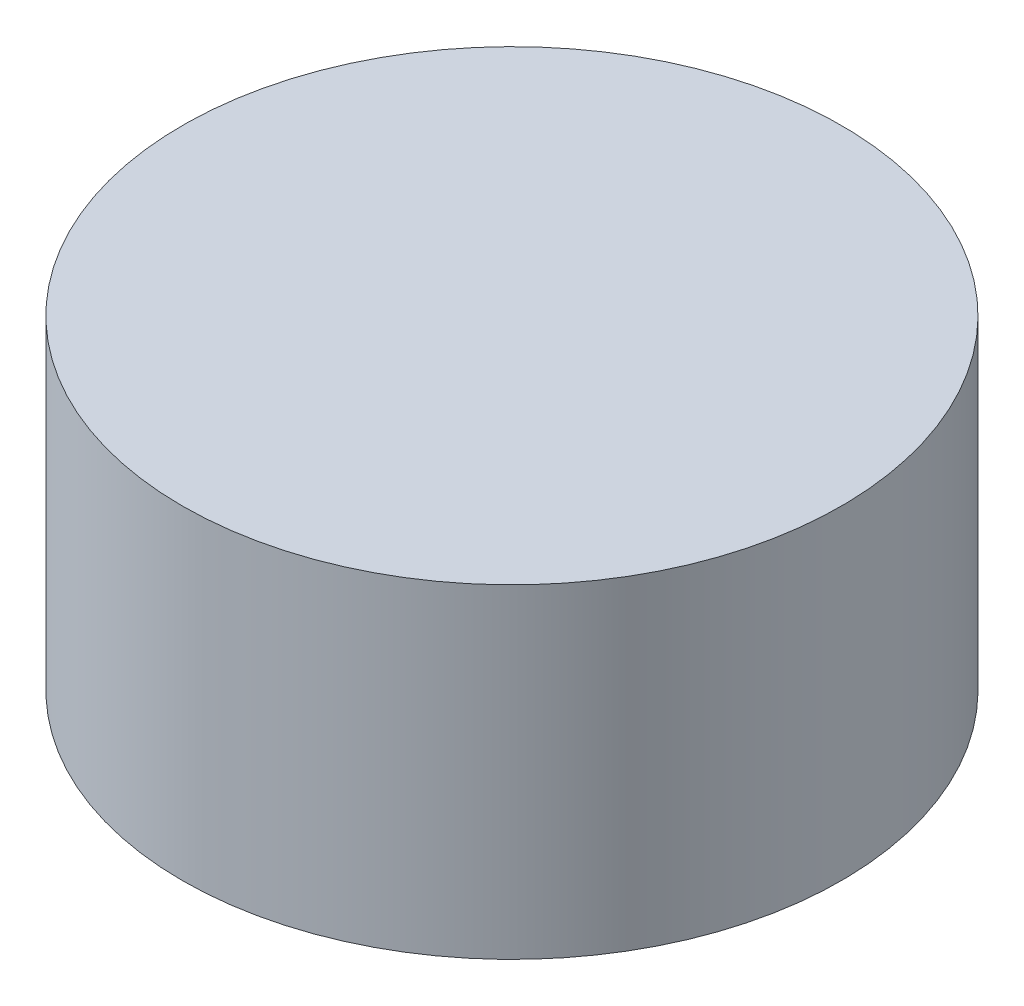
ISO-10303-21;
HEADER;
FILE_DESCRIPTION(('STEP AP214'),'2;1');
FILE_NAME('part.step','',(''),(''),'','','');
FILE_SCHEMA(('AUTOMOTIVE_DESIGN { 1 0 10303 214 1 1 1 1 }'));
ENDSEC;
DATA;
#1=APPLICATION_CONTEXT('core data for automotive mechanical design processes');
#2=APPLICATION_PROTOCOL_DEFINITION('international standard','automotive_design',2000,#1);
#3=PRODUCT_CONTEXT('',#1,'mechanical');
#4=PRODUCT('Part','Part','',(#3));
#5=PRODUCT_RELATED_PRODUCT_CATEGORY('part','',(#4));
#6=PRODUCT_DEFINITION_FORMATION('','',#4);
#7=PRODUCT_DEFINITION_CONTEXT('part definition',#1,'design');
#8=PRODUCT_DEFINITION('design','',#6,#7);
#9=PRODUCT_DEFINITION_SHAPE('','',#8);
#10=(LENGTH_UNIT() NAMED_UNIT(*) SI_UNIT(.MILLI.,.METRE.));
#11=(NAMED_UNIT(*) PLANE_ANGLE_UNIT() SI_UNIT($,.RADIAN.));
#12=(NAMED_UNIT(*) SI_UNIT($,.STERADIAN.) SOLID_ANGLE_UNIT());
#13=UNCERTAINTY_MEASURE_WITH_UNIT(LENGTH_MEASURE(1.E-05),#10,'distance_accuracy_value','');
#14=(GEOMETRIC_REPRESENTATION_CONTEXT(3) GLOBAL_UNCERTAINTY_ASSIGNED_CONTEXT((#13)) GLOBAL_UNIT_ASSIGNED_CONTEXT((#10,
#11,#12)) REPRESENTATION_CONTEXT('',''));
#15=CARTESIAN_POINT('',(0.,0.,0.));
#16=DIRECTION('',(0.,0.,1.));
#17=DIRECTION('',(1.,0.,0.));
#18=AXIS2_PLACEMENT_3D('',#15,#16,#17);
#19=CARTESIAN_POINT('',(0.,3.15,0.));
#20=DIRECTION('',(0.,-1.,0.));
#21=DIRECTION('',(0.,0.,-1.));
#22=AXIS2_PLACEMENT_3D('',#19,#20,#21);
#23=CYLINDRICAL_SURFACE('',#22,3.2);
#24=CARTESIAN_POINT('',(0.,3.15,0.));
#25=DIRECTION('',(0.,1.,0.));
#26=DIRECTION('',(0.,0.,1.));
#27=AXIS2_PLACEMENT_3D('',#24,#25,#26);
#28=CIRCLE('',#27,3.2);
#29=CARTESIAN_POINT('',(0.,3.15,3.2));
#30=VERTEX_POINT('',#29);
#31=EDGE_CURVE('E10',#30,#30,#28,.T.);
#32=ORIENTED_EDGE('',*,*,#31,.F.);
#33=EDGE_LOOP('',(#32));
#34=FACE_BOUND('',#33,.T.);
#35=CARTESIAN_POINT('',(0.,0.,0.));
#36=DIRECTION('',(0.,1.,0.));
#37=DIRECTION('',(0.,0.,1.));
#38=AXIS2_PLACEMENT_3D('',#35,#36,#37);
#39=CIRCLE('',#38,3.2);
#40=CARTESIAN_POINT('',(0.,0.,3.2));
#41=VERTEX_POINT('',#40);
#42=EDGE_CURVE('E34',#41,#41,#39,.T.);
#43=ORIENTED_EDGE('',*,*,#42,.T.);
#44=EDGE_LOOP('',(#43));
#45=FACE_BOUND('',#44,.T.);
#46=ADVANCED_FACE('F31',(#34,#45),#23,.T.);
#47=CARTESIAN_POINT('',(0.,3.15,0.));
#48=DIRECTION('',(0.,1.,0.));
#49=DIRECTION('',(0.,0.,1.));
#50=AXIS2_PLACEMENT_3D('',#47,#48,#49);
#51=PLANE('',#50);
#52=ORIENTED_EDGE('',*,*,#31,.T.);
#53=EDGE_LOOP('',(#52));
#54=FACE_BOUND('',#53,.T.);
#55=ADVANCED_FACE('F46',(#54),#51,.T.);
#56=CARTESIAN_POINT('',(0.,0.,0.));
#57=DIRECTION('',(0.,1.,0.));
#58=DIRECTION('',(0.,0.,1.));
#59=AXIS2_PLACEMENT_3D('',#56,#57,#58);
#60=PLANE('',#59);
#61=ORIENTED_EDGE('',*,*,#42,.F.);
#62=EDGE_LOOP('',(#61));
#63=FACE_BOUND('',#62,.T.);
#64=ADVANCED_FACE('F44',(#63),#60,.F.);
#65=CLOSED_SHELL('',(#46,#55,#64));
#66=MANIFOLD_SOLID_BREP('B2',#65);
#67=ADVANCED_BREP_SHAPE_REPRESENTATION('',(#18,#66),#14);
#68=SHAPE_DEFINITION_REPRESENTATION(#9,#67);
ENDSEC;
END-ISO-10303-21;
